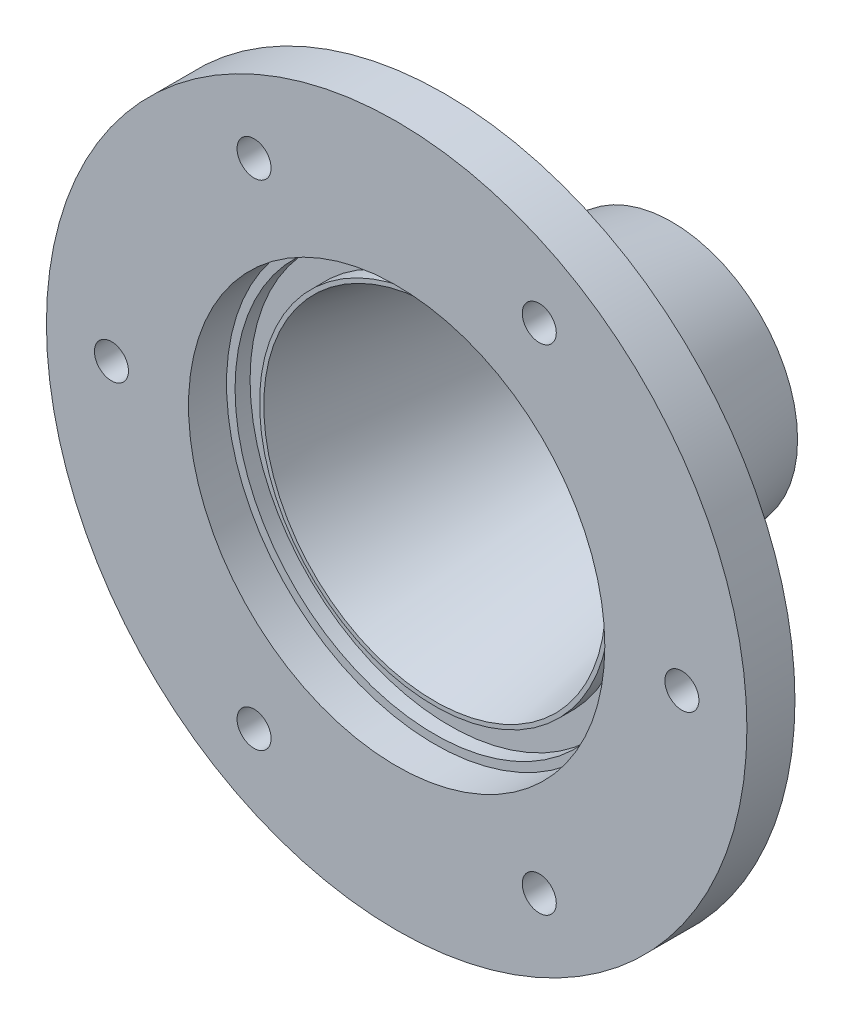
ISO-10303-21;
HEADER;
FILE_DESCRIPTION(('STEP AP214'),'2;1');
FILE_NAME('part.step','',(''),(''),'','','');
FILE_SCHEMA(('AUTOMOTIVE_DESIGN { 1 0 10303 214 1 1 1 1 }'));
ENDSEC;
DATA;
#1=APPLICATION_CONTEXT('core data for automotive mechanical design processes');
#2=APPLICATION_PROTOCOL_DEFINITION('international standard','automotive_design',2000,#1);
#3=PRODUCT_CONTEXT('',#1,'mechanical');
#4=PRODUCT('Part','Part','',(#3));
#5=PRODUCT_RELATED_PRODUCT_CATEGORY('part','',(#4));
#6=PRODUCT_DEFINITION_FORMATION('','',#4);
#7=PRODUCT_DEFINITION_CONTEXT('part definition',#1,'design');
#8=PRODUCT_DEFINITION('design','',#6,#7);
#9=PRODUCT_DEFINITION_SHAPE('','',#8);
#10=(LENGTH_UNIT() NAMED_UNIT(*) SI_UNIT(.MILLI.,.METRE.));
#11=(NAMED_UNIT(*) PLANE_ANGLE_UNIT() SI_UNIT($,.RADIAN.));
#12=(NAMED_UNIT(*) SI_UNIT($,.STERADIAN.) SOLID_ANGLE_UNIT());
#13=UNCERTAINTY_MEASURE_WITH_UNIT(LENGTH_MEASURE(1.E-05),#10,'distance_accuracy_value','');
#14=(GEOMETRIC_REPRESENTATION_CONTEXT(3) GLOBAL_UNCERTAINTY_ASSIGNED_CONTEXT((#13)) GLOBAL_UNIT_ASSIGNED_CONTEXT((#10,
#11,#12)) REPRESENTATION_CONTEXT('',''));
#15=CARTESIAN_POINT('',(0.,0.,0.));
#16=DIRECTION('',(0.,0.,1.));
#17=DIRECTION('',(1.,0.,0.));
#18=AXIS2_PLACEMENT_3D('',#15,#16,#17);
#19=CARTESIAN_POINT('',(0.,0.,-6.8));
#20=DIRECTION('',(0.,0.,1.));
#21=DIRECTION('',(1.,0.,0.));
#22=AXIS2_PLACEMENT_3D('',#19,#20,#21);
#23=CYLINDRICAL_SURFACE('',#22,35.);
#24=CARTESIAN_POINT('',(0.,0.,0.));
#25=DIRECTION('',(0.,0.,1.));
#26=DIRECTION('',(1.,0.,0.));
#27=AXIS2_PLACEMENT_3D('',#24,#25,#26);
#28=CIRCLE('',#27,35.);
#29=CARTESIAN_POINT('',(35.,0.,0.));
#30=VERTEX_POINT('',#29);
#31=EDGE_CURVE('E10',#30,#30,#28,.T.);
#32=ORIENTED_EDGE('',*,*,#31,.F.);
#33=EDGE_LOOP('',(#32));
#34=FACE_BOUND('',#33,.T.);
#35=CARTESIAN_POINT('',(0.,0.,-4.8));
#36=DIRECTION('',(0.,0.,-1.));
#37=DIRECTION('',(-1.,0.,0.));
#38=AXIS2_PLACEMENT_3D('',#35,#36,#37);
#39=CIRCLE('',#38,35.);
#40=CARTESIAN_POINT('',(-35.,0.,-4.8));
#41=VERTEX_POINT('',#40);
#42=EDGE_CURVE('E78',#41,#41,#39,.F.);
#43=ORIENTED_EDGE('',*,*,#42,.T.);
#44=EDGE_LOOP('',(#43));
#45=FACE_BOUND('',#44,.T.);
#46=ADVANCED_FACE('F32',(#34,#45),#23,.T.);
#47=CARTESIAN_POINT('',(-28.5,0.,0.));
#48=DIRECTION('',(0.,0.,1.));
#49=DIRECTION('',(1.,0.,0.));
#50=AXIS2_PLACEMENT_3D('',#47,#48,#49);
#51=CYLINDRICAL_SURFACE('',#50,1.7);
#52=CARTESIAN_POINT('',(-28.5,0.,0.));
#53=DIRECTION('',(0.,0.,1.));
#54=DIRECTION('',(1.,0.,0.));
#55=AXIS2_PLACEMENT_3D('',#52,#53,#54);
#56=CIRCLE('',#55,1.7);
#57=CARTESIAN_POINT('',(-26.8,0.,0.));
#58=VERTEX_POINT('',#57);
#59=EDGE_CURVE('E39',#58,#58,#56,.T.);
#60=ORIENTED_EDGE('',*,*,#59,.T.);
#61=EDGE_LOOP('',(#60));
#62=FACE_BOUND('',#61,.T.);
#63=CARTESIAN_POINT('',(-28.5,0.,-4.8));
#64=DIRECTION('',(0.,0.,-1.));
#65=DIRECTION('',(-1.,0.,0.));
#66=AXIS2_PLACEMENT_3D('',#63,#64,#65);
#67=CIRCLE('',#66,1.7);
#68=CARTESIAN_POINT('',(-30.2,0.,-4.8));
#69=VERTEX_POINT('',#68);
#70=EDGE_CURVE('E75',#69,#69,#67,.F.);
#71=ORIENTED_EDGE('',*,*,#70,.F.);
#72=EDGE_LOOP('',(#71));
#73=FACE_BOUND('',#72,.T.);
#74=ADVANCED_FACE('F124',(#62,#73),#51,.F.);
#75=CARTESIAN_POINT('',(-14.2499999999999,-24.6817240078565,0.));
#76=DIRECTION('',(0.,0.,1.));
#77=DIRECTION('',(1.,0.,0.));
#78=AXIS2_PLACEMENT_3D('',#75,#76,#77);
#79=CYLINDRICAL_SURFACE('',#78,1.7);
#80=CARTESIAN_POINT('',(-14.2499999999999,-24.6817240078565,0.));
#81=DIRECTION('',(0.,0.,1.));
#82=DIRECTION('',(1.,0.,0.));
#83=AXIS2_PLACEMENT_3D('',#80,#81,#82);
#84=CIRCLE('',#83,1.7);
#85=CARTESIAN_POINT('',(-12.5499999999999,-24.6817240078565,0.));
#86=VERTEX_POINT('',#85);
#87=EDGE_CURVE('E44',#86,#86,#84,.T.);
#88=ORIENTED_EDGE('',*,*,#87,.T.);
#89=EDGE_LOOP('',(#88));
#90=FACE_BOUND('',#89,.T.);
#91=CARTESIAN_POINT('',(-14.2499999999999,-24.6817240078565,-4.8));
#92=DIRECTION('',(0.,0.,-1.));
#93=DIRECTION('',(-1.,0.,0.));
#94=AXIS2_PLACEMENT_3D('',#91,#92,#93);
#95=CIRCLE('',#94,1.7);
#96=CARTESIAN_POINT('',(-15.9499999999999,-24.6817240078565,-4.8));
#97=VERTEX_POINT('',#96);
#98=EDGE_CURVE('E72',#97,#97,#95,.F.);
#99=ORIENTED_EDGE('',*,*,#98,.F.);
#100=EDGE_LOOP('',(#99));
#101=FACE_BOUND('',#100,.T.);
#102=ADVANCED_FACE('F113',(#90,#101),#79,.F.);
#103=CARTESIAN_POINT('',(14.2500000000001,-24.6817240078564,0.));
#104=DIRECTION('',(0.,0.,1.));
#105=DIRECTION('',(1.,0.,0.));
#106=AXIS2_PLACEMENT_3D('',#103,#104,#105);
#107=CYLINDRICAL_SURFACE('',#106,1.7);
#108=CARTESIAN_POINT('',(14.2500000000001,-24.6817240078564,0.));
#109=DIRECTION('',(0.,0.,1.));
#110=DIRECTION('',(1.,0.,0.));
#111=AXIS2_PLACEMENT_3D('',#108,#109,#110);
#112=CIRCLE('',#111,1.7);
#113=CARTESIAN_POINT('',(15.9500000000001,-24.6817240078564,0.));
#114=VERTEX_POINT('',#113);
#115=EDGE_CURVE('E108',#114,#114,#112,.T.);
#116=ORIENTED_EDGE('',*,*,#115,.T.);
#117=EDGE_LOOP('',(#116));
#118=FACE_BOUND('',#117,.T.);
#119=CARTESIAN_POINT('',(14.2500000000001,-24.6817240078564,-4.8));
#120=DIRECTION('',(0.,0.,-1.));
#121=DIRECTION('',(-1.,0.,0.));
#122=AXIS2_PLACEMENT_3D('',#119,#120,#121);
#123=CIRCLE('',#122,1.7);
#124=CARTESIAN_POINT('',(12.5500000000001,-24.6817240078564,-4.8));
#125=VERTEX_POINT('',#124);
#126=EDGE_CURVE('E69',#125,#125,#123,.F.);
#127=ORIENTED_EDGE('',*,*,#126,.F.);
#128=EDGE_LOOP('',(#127));
#129=FACE_BOUND('',#128,.T.);
#130=ADVANCED_FACE('F165',(#118,#129),#107,.F.);
#131=CARTESIAN_POINT('',(28.5,0.,0.));
#132=DIRECTION('',(0.,0.,1.));
#133=DIRECTION('',(1.,0.,0.));
#134=AXIS2_PLACEMENT_3D('',#131,#132,#133);
#135=CYLINDRICAL_SURFACE('',#134,1.7);
#136=CARTESIAN_POINT('',(28.5,0.,0.));
#137=DIRECTION('',(0.,0.,1.));
#138=DIRECTION('',(1.,0.,0.));
#139=AXIS2_PLACEMENT_3D('',#136,#137,#138);
#140=CIRCLE('',#139,1.7);
#141=CARTESIAN_POINT('',(30.2,0.,0.));
#142=VERTEX_POINT('',#141);
#143=EDGE_CURVE('E105',#142,#142,#140,.T.);
#144=ORIENTED_EDGE('',*,*,#143,.T.);
#145=EDGE_LOOP('',(#144));
#146=FACE_BOUND('',#145,.T.);
#147=CARTESIAN_POINT('',(28.5,0.,-4.8));
#148=DIRECTION('',(0.,0.,-1.));
#149=DIRECTION('',(-1.,0.,0.));
#150=AXIS2_PLACEMENT_3D('',#147,#148,#149);
#151=CIRCLE('',#150,1.7);
#152=CARTESIAN_POINT('',(26.8,0.,-4.8));
#153=VERTEX_POINT('',#152);
#154=EDGE_CURVE('E54',#153,#153,#151,.F.);
#155=ORIENTED_EDGE('',*,*,#154,.F.);
#156=EDGE_LOOP('',(#155));
#157=FACE_BOUND('',#156,.T.);
#158=ADVANCED_FACE('F172',(#146,#157),#135,.F.);
#159=CARTESIAN_POINT('',(14.2499999999998,24.6817240078566,0.));
#160=DIRECTION('',(0.,0.,1.));
#161=DIRECTION('',(1.,0.,0.));
#162=AXIS2_PLACEMENT_3D('',#159,#160,#161);
#163=CYLINDRICAL_SURFACE('',#162,1.7);
#164=CARTESIAN_POINT('',(14.2499999999998,24.6817240078566,0.));
#165=DIRECTION('',(0.,0.,1.));
#166=DIRECTION('',(1.,0.,0.));
#167=AXIS2_PLACEMENT_3D('',#164,#165,#166);
#168=CIRCLE('',#167,1.7);
#169=CARTESIAN_POINT('',(15.9499999999998,24.6817240078566,0.));
#170=VERTEX_POINT('',#169);
#171=EDGE_CURVE('E102',#170,#170,#168,.T.);
#172=ORIENTED_EDGE('',*,*,#171,.T.);
#173=EDGE_LOOP('',(#172));
#174=FACE_BOUND('',#173,.T.);
#175=CARTESIAN_POINT('',(14.2499999999998,24.6817240078566,-4.8));
#176=DIRECTION('',(0.,0.,-1.));
#177=DIRECTION('',(-1.,0.,0.));
#178=AXIS2_PLACEMENT_3D('',#175,#176,#177);
#179=CIRCLE('',#178,1.7);
#180=CARTESIAN_POINT('',(12.5499999999998,24.6817240078566,-4.8));
#181=VERTEX_POINT('',#180);
#182=EDGE_CURVE('E49',#181,#181,#179,.F.);
#183=ORIENTED_EDGE('',*,*,#182,.F.);
#184=EDGE_LOOP('',(#183));
#185=FACE_BOUND('',#184,.T.);
#186=ADVANCED_FACE('F180',(#174,#185),#163,.F.);
#187=CARTESIAN_POINT('',(-14.2500000000003,24.6817240078563,0.));
#188=DIRECTION('',(0.,0.,1.));
#189=DIRECTION('',(1.,0.,0.));
#190=AXIS2_PLACEMENT_3D('',#187,#188,#189);
#191=CYLINDRICAL_SURFACE('',#190,1.7);
#192=CARTESIAN_POINT('',(-14.2500000000003,24.6817240078563,0.));
#193=DIRECTION('',(0.,0.,1.));
#194=DIRECTION('',(1.,0.,0.));
#195=AXIS2_PLACEMENT_3D('',#192,#193,#194);
#196=CIRCLE('',#195,1.7);
#197=CARTESIAN_POINT('',(-12.5500000000003,24.6817240078563,0.));
#198=VERTEX_POINT('',#197);
#199=EDGE_CURVE('E97',#198,#198,#196,.T.);
#200=ORIENTED_EDGE('',*,*,#199,.T.);
#201=EDGE_LOOP('',(#200));
#202=FACE_BOUND('',#201,.T.);
#203=CARTESIAN_POINT('',(-14.2500000000003,24.6817240078563,-4.8));
#204=DIRECTION('',(0.,0.,-1.));
#205=DIRECTION('',(-1.,0.,0.));
#206=AXIS2_PLACEMENT_3D('',#203,#204,#205);
#207=CIRCLE('',#206,1.7);
#208=CARTESIAN_POINT('',(-15.9500000000003,24.6817240078563,-4.8));
#209=VERTEX_POINT('',#208);
#210=EDGE_CURVE('E47',#209,#209,#207,.F.);
#211=ORIENTED_EDGE('',*,*,#210,.F.);
#212=EDGE_LOOP('',(#211));
#213=FACE_BOUND('',#212,.T.);
#214=ADVANCED_FACE('F120',(#202,#213),#191,.F.);
#215=CARTESIAN_POINT('',(0.,0.,0.));
#216=DIRECTION('',(0.,0.,1.));
#217=DIRECTION('',(1.,0.,0.));
#218=AXIS2_PLACEMENT_3D('',#215,#216,#217);
#219=PLANE('',#218);
#220=CARTESIAN_POINT('',(0.,0.,0.));
#221=DIRECTION('',(0.,0.,1.));
#222=DIRECTION('',(1.,0.,0.));
#223=AXIS2_PLACEMENT_3D('',#220,#221,#222);
#224=CIRCLE('',#223,20.8);
#225=CARTESIAN_POINT('',(20.8,0.,0.));
#226=VERTEX_POINT('',#225);
#227=EDGE_CURVE('E91',#226,#226,#224,.T.);
#228=ORIENTED_EDGE('',*,*,#227,.F.);
#229=EDGE_LOOP('',(#228));
#230=FACE_BOUND('',#229,.T.);
#231=ORIENTED_EDGE('',*,*,#199,.F.);
#232=EDGE_LOOP('',(#231));
#233=FACE_BOUND('',#232,.T.);
#234=ORIENTED_EDGE('',*,*,#171,.F.);
#235=EDGE_LOOP('',(#234));
#236=FACE_BOUND('',#235,.T.);
#237=ORIENTED_EDGE('',*,*,#143,.F.);
#238=EDGE_LOOP('',(#237));
#239=FACE_BOUND('',#238,.T.);
#240=ORIENTED_EDGE('',*,*,#115,.F.);
#241=EDGE_LOOP('',(#240));
#242=FACE_BOUND('',#241,.T.);
#243=ORIENTED_EDGE('',*,*,#87,.F.);
#244=EDGE_LOOP('',(#243));
#245=FACE_BOUND('',#244,.T.);
#246=ORIENTED_EDGE('',*,*,#59,.F.);
#247=EDGE_LOOP('',(#246));
#248=FACE_BOUND('',#247,.T.);
#249=ORIENTED_EDGE('',*,*,#31,.T.);
#250=EDGE_LOOP('',(#249));
#251=FACE_BOUND('',#250,.T.);
#252=ADVANCED_FACE('F116',(#230,#233,#236,#239,#242,#245,#248,#251),#219,.T.);
#253=CARTESIAN_POINT('',(0.,0.,-3.8));
#254=DIRECTION('',(0.,0.,1.));
#255=DIRECTION('',(1.,0.,0.));
#256=AXIS2_PLACEMENT_3D('',#253,#254,#255);
#257=CYLINDRICAL_SURFACE('',#256,20.8);
#258=CARTESIAN_POINT('',(0.,0.,-3.8));
#259=DIRECTION('',(0.,0.,1.));
#260=DIRECTION('',(1.,0.,0.));
#261=AXIS2_PLACEMENT_3D('',#258,#259,#260);
#262=CIRCLE('',#261,20.8);
#263=CARTESIAN_POINT('',(20.8,0.,-3.8));
#264=VERTEX_POINT('',#263);
#265=EDGE_CURVE('E94',#264,#264,#262,.T.);
#266=CARTESIAN_POINT('',(20.8,0.,-3.8));
#267=CARTESIAN_POINT('',(20.8,0.,-3.76041666666667));
#268=CARTESIAN_POINT('',(20.8,0.,-3.72083333333333));
#269=CARTESIAN_POINT('',(20.8,0.,-3.64166666666667));
#270=CARTESIAN_POINT('',(20.8,0.,-3.60208333333333));
#271=CARTESIAN_POINT('',(20.8,0.,-3.52291666666667));
#272=CARTESIAN_POINT('',(20.8,0.,-3.48333333333333));
#273=CARTESIAN_POINT('',(20.8,0.,-3.40416666666667));
#274=CARTESIAN_POINT('',(20.8,0.,-3.36458333333333));
#275=CARTESIAN_POINT('',(20.8,0.,-3.28541666666667));
#276=CARTESIAN_POINT('',(20.8,0.,-3.24583333333333));
#277=CARTESIAN_POINT('',(20.8,0.,-3.16666666666667));
#278=CARTESIAN_POINT('',(20.8,0.,-3.12708333333333));
#279=CARTESIAN_POINT('',(20.8,0.,-3.04791666666667));
#280=CARTESIAN_POINT('',(20.8,0.,-3.00833333333333));
#281=CARTESIAN_POINT('',(20.8,0.,-2.92916666666667));
#282=CARTESIAN_POINT('',(20.8,0.,-2.88958333333333));
#283=CARTESIAN_POINT('',(20.8,0.,-2.81041666666667));
#284=CARTESIAN_POINT('',(20.8,0.,-2.77083333333333));
#285=CARTESIAN_POINT('',(20.8,0.,-2.69166666666667));
#286=CARTESIAN_POINT('',(20.8,0.,-2.65208333333333));
#287=CARTESIAN_POINT('',(20.8,0.,-2.57291666666667));
#288=CARTESIAN_POINT('',(20.8,0.,-2.53333333333333));
#289=CARTESIAN_POINT('',(20.8,0.,-2.45416666666667));
#290=CARTESIAN_POINT('',(20.8,0.,-2.41458333333333));
#291=CARTESIAN_POINT('',(20.8,0.,-2.33541666666667));
#292=CARTESIAN_POINT('',(20.8,0.,-2.29583333333333));
#293=CARTESIAN_POINT('',(20.8,0.,-2.21666666666667));
#294=CARTESIAN_POINT('',(20.8,0.,-2.17708333333333));
#295=CARTESIAN_POINT('',(20.8,0.,-2.09791666666667));
#296=CARTESIAN_POINT('',(20.8,0.,-2.05833333333333));
#297=CARTESIAN_POINT('',(20.8,0.,-1.97916666666667));
#298=CARTESIAN_POINT('',(20.8,0.,-1.93958333333333));
#299=CARTESIAN_POINT('',(20.8,0.,-1.86041666666667));
#300=CARTESIAN_POINT('',(20.8,0.,-1.82083333333333));
#301=CARTESIAN_POINT('',(20.8,0.,-1.74166666666667));
#302=CARTESIAN_POINT('',(20.8,0.,-1.70208333333333));
#303=CARTESIAN_POINT('',(20.8,0.,-1.62291666666667));
#304=CARTESIAN_POINT('',(20.8,0.,-1.58333333333333));
#305=CARTESIAN_POINT('',(20.8,0.,-1.50416666666667));
#306=CARTESIAN_POINT('',(20.8,0.,-1.46458333333333));
#307=CARTESIAN_POINT('',(20.8,0.,-1.38541666666667));
#308=CARTESIAN_POINT('',(20.8,0.,-1.34583333333333));
#309=CARTESIAN_POINT('',(20.8,0.,-1.26666666666667));
#310=CARTESIAN_POINT('',(20.8,0.,-1.22708333333333));
#311=CARTESIAN_POINT('',(20.8,0.,-1.14791666666667));
#312=CARTESIAN_POINT('',(20.8,0.,-1.10833333333333));
#313=CARTESIAN_POINT('',(20.8,0.,-1.02916666666667));
#314=CARTESIAN_POINT('',(20.8,0.,-0.989583333333334));
#315=CARTESIAN_POINT('',(20.8,0.,-0.910416666666667));
#316=CARTESIAN_POINT('',(20.8,0.,-0.870833333333333));
#317=CARTESIAN_POINT('',(20.8,0.,-0.791666666666667));
#318=CARTESIAN_POINT('',(20.8,0.,-0.752083333333333));
#319=CARTESIAN_POINT('',(20.8,0.,-0.672916666666667));
#320=CARTESIAN_POINT('',(20.8,0.,-0.633333333333333));
#321=CARTESIAN_POINT('',(20.8,0.,-0.554166666666667));
#322=CARTESIAN_POINT('',(20.8,0.,-0.514583333333334));
#323=CARTESIAN_POINT('',(20.8,0.,-0.435416666666667));
#324=CARTESIAN_POINT('',(20.8,0.,-0.395833333333334));
#325=CARTESIAN_POINT('',(20.8,0.,-0.316666666666667));
#326=CARTESIAN_POINT('',(20.8,0.,-0.277083333333333));
#327=CARTESIAN_POINT('',(20.8,0.,-0.197916666666667));
#328=CARTESIAN_POINT('',(20.8,0.,-0.158333333333333));
#329=CARTESIAN_POINT('',(20.8,0.,-0.0791666666666666));
#330=CARTESIAN_POINT('',(20.8,0.,-0.0395833333333333));
#331=CARTESIAN_POINT('',(20.8,0.,0.));
#332=B_SPLINE_CURVE_WITH_KNOTS('',3,(#266,#267,#268,#269,#270,#271,#272,#273,#274,#275,#276,
#277,#278,#279,#280,#281,#282,#283,#284,#285,#286,#287,#288,#289,#290,#291,#292,#293,#294,#295,
#296,#297,#298,#299,#300,#301,#302,#303,#304,#305,#306,#307,#308,#309,#310,#311,#312,#313,#314,
#315,#316,#317,#318,#319,#320,#321,#322,#323,#324,#325,#326,#327,#328,#329,#330,#331),
.UNSPECIFIED.,.F.,.F.,(4,2,2,2,2,2,2,2,2,2,2,2,2,2,2,2,2,2,2,2,2,2,2,2,2,2,2,2,2,2,2,2,4),(0.,
0.11875,0.2375,0.35625,0.475,0.59375,0.7125,0.83125,0.95,1.06875,1.1875,1.30625,1.425,1.54375,
1.6625,1.78125,1.9,2.01875,2.1375,2.25625,2.375,2.49375,2.6125,2.73125,2.85,2.96875,3.0875,
3.20625,3.325,3.44375,3.5625,3.68125,3.8),.UNSPECIFIED.);
#333=EDGE_CURVE('BSEAM119',#264,#226,#332,.T.);
#334=ORIENTED_EDGE('',*,*,#265,.F.);
#335=ORIENTED_EDGE('',*,*,#227,.T.);
#336=ORIENTED_EDGE('',*,*,#333,.T.);
#337=ORIENTED_EDGE('',*,*,#333,.F.);
#338=EDGE_LOOP('',(#334,#336,#335,#337));
#339=FACE_BOUND('',#338,.T.);
#340=ADVANCED_FACE('F119',(#339),#257,.F.);
#341=CARTESIAN_POINT('',(0.,0.,-3.8));
#342=DIRECTION('',(0.,0.,1.));
#343=DIRECTION('',(1.,0.,0.));
#344=AXIS2_PLACEMENT_3D('',#341,#342,#343);
#345=PLANE('',#344);
#346=CARTESIAN_POINT('',(0.,0.,-3.8));
#347=DIRECTION('',(0.,0.,1.));
#348=DIRECTION('',(1.,0.,0.));
#349=AXIS2_PLACEMENT_3D('',#346,#347,#348);
#350=CIRCLE('',#349,19.95);
#351=CARTESIAN_POINT('',(19.95,0.,-3.8));
#352=VERTEX_POINT('',#351);
#353=EDGE_CURVE('E85',#352,#352,#350,.T.);
#354=ORIENTED_EDGE('',*,*,#353,.F.);
#355=EDGE_LOOP('',(#354));
#356=FACE_BOUND('',#355,.T.);
#357=ORIENTED_EDGE('',*,*,#265,.T.);
#358=EDGE_LOOP('',(#357));
#359=FACE_BOUND('',#358,.T.);
#360=ADVANCED_FACE('F145',(#356,#359),#345,.T.);
#361=CARTESIAN_POINT('',(0.,0.,-5.3));
#362=DIRECTION('',(0.,0.,1.));
#363=DIRECTION('',(1.,0.,0.));
#364=AXIS2_PLACEMENT_3D('',#361,#362,#363);
#365=CYLINDRICAL_SURFACE('',#364,19.95);
#366=CARTESIAN_POINT('',(0.,0.,-5.3));
#367=DIRECTION('',(0.,0.,1.));
#368=DIRECTION('',(1.,0.,0.));
#369=AXIS2_PLACEMENT_3D('',#366,#367,#368);
#370=CIRCLE('',#369,19.95);
#371=CARTESIAN_POINT('',(19.95,0.,-5.3));
#372=VERTEX_POINT('',#371);
#373=EDGE_CURVE('E88',#372,#372,#370,.T.);
#374=ORIENTED_EDGE('',*,*,#373,.F.);
#375=EDGE_LOOP('',(#374));
#376=FACE_BOUND('',#375,.T.);
#377=ORIENTED_EDGE('',*,*,#353,.T.);
#378=EDGE_LOOP('',(#377));
#379=FACE_BOUND('',#378,.T.);
#380=ADVANCED_FACE('F213',(#376,#379),#365,.F.);
#381=CARTESIAN_POINT('',(0.,0.,-5.3));
#382=DIRECTION('',(0.,0.,1.));
#383=DIRECTION('',(1.,0.,0.));
#384=AXIS2_PLACEMENT_3D('',#381,#382,#383);
#385=PLANE('',#384);
#386=CARTESIAN_POINT('',(0.,0.,-5.3));
#387=DIRECTION('',(0.,0.,1.));
#388=DIRECTION('',(1.,0.,0.));
#389=AXIS2_PLACEMENT_3D('',#386,#387,#388);
#390=CIRCLE('',#389,17.5);
#391=CARTESIAN_POINT('',(17.5,0.,-5.3));
#392=VERTEX_POINT('',#391);
#393=EDGE_CURVE('E82',#392,#392,#390,.T.);
#394=ORIENTED_EDGE('',*,*,#393,.F.);
#395=EDGE_LOOP('',(#394));
#396=FACE_BOUND('',#395,.T.);
#397=ORIENTED_EDGE('',*,*,#373,.T.);
#398=EDGE_LOOP('',(#397));
#399=FACE_BOUND('',#398,.T.);
#400=ADVANCED_FACE('F220',(#396,#399),#385,.T.);
#401=CARTESIAN_POINT('',(0.,0.,-5.3));
#402=DIRECTION('',(0.,0.,1.));
#403=DIRECTION('',(1.,0.,0.));
#404=AXIS2_PLACEMENT_3D('',#401,#402,#403);
#405=CYLINDRICAL_SURFACE('',#404,17.5);
#406=ORIENTED_EDGE('',*,*,#393,.T.);
#407=EDGE_LOOP('',(#406));
#408=FACE_BOUND('',#407,.T.);
#409=CARTESIAN_POINT('',(0.,0.,-3.8));
#410=DIRECTION('',(0.,0.,1.));
#411=DIRECTION('',(1.,0.,0.));
#412=AXIS2_PLACEMENT_3D('',#409,#410,#411);
#413=CIRCLE('',#412,17.5);
#414=CARTESIAN_POINT('',(17.5,0.,-3.8));
#415=VERTEX_POINT('',#414);
#416=EDGE_CURVE('E81',#415,#415,#413,.T.);
#417=ORIENTED_EDGE('',*,*,#416,.F.);
#418=EDGE_LOOP('',(#417));
#419=FACE_BOUND('',#418,.T.);
#420=ADVANCED_FACE('F142',(#408,#419),#405,.T.);
#421=CARTESIAN_POINT('',(0.,0.,-3.8));
#422=DIRECTION('',(0.,0.,1.));
#423=DIRECTION('',(1.,0.,0.));
#424=AXIS2_PLACEMENT_3D('',#421,#422,#423);
#425=CIRCLE('',#424,17.08);
#426=CARTESIAN_POINT('',(17.08,0.,-3.8));
#427=VERTEX_POINT('',#426);
#428=EDGE_CURVE('E283',#427,#427,#425,.T.);
#429=ORIENTED_EDGE('',*,*,#428,.F.);
#430=EDGE_LOOP('',(#429));
#431=FACE_BOUND('',#430,.T.);
#432=ORIENTED_EDGE('',*,*,#416,.T.);
#433=EDGE_LOOP('',(#432));
#434=FACE_BOUND('',#433,.T.);
#435=ADVANCED_FACE('F133',(#431,#434),#345,.T.);
#436=CARTESIAN_POINT('',(0.,0.,-4.8));
#437=DIRECTION('',(0.,0.,-1.));
#438=DIRECTION('',(-1.,0.,0.));
#439=AXIS2_PLACEMENT_3D('',#436,#437,#438);
#440=PLANE('',#439);
#441=ORIENTED_EDGE('',*,*,#42,.F.);
#442=EDGE_LOOP('',(#441));
#443=FACE_BOUND('',#442,.T.);
#444=CARTESIAN_POINT('',(0.,0.,-4.8));
#445=DIRECTION('',(0.,0.,-1.));
#446=DIRECTION('',(-1.,0.,0.));
#447=AXIS2_PLACEMENT_3D('',#444,#445,#446);
#448=CIRCLE('',#447,24.95);
#449=CARTESIAN_POINT('',(-24.95,0.,-4.8));
#450=VERTEX_POINT('',#449);
#451=EDGE_CURVE('E50',#450,#450,#448,.T.);
#452=ORIENTED_EDGE('',*,*,#451,.F.);
#453=EDGE_LOOP('',(#452));
#454=FACE_BOUND('',#453,.T.);
#455=ORIENTED_EDGE('',*,*,#210,.T.);
#456=EDGE_LOOP('',(#455));
#457=FACE_BOUND('',#456,.T.);
#458=ORIENTED_EDGE('',*,*,#182,.T.);
#459=EDGE_LOOP('',(#458));
#460=FACE_BOUND('',#459,.T.);
#461=ORIENTED_EDGE('',*,*,#154,.T.);
#462=EDGE_LOOP('',(#461));
#463=FACE_BOUND('',#462,.T.);
#464=ORIENTED_EDGE('',*,*,#126,.T.);
#465=EDGE_LOOP('',(#464));
#466=FACE_BOUND('',#465,.T.);
#467=ORIENTED_EDGE('',*,*,#98,.T.);
#468=EDGE_LOOP('',(#467));
#469=FACE_BOUND('',#468,.T.);
#470=ORIENTED_EDGE('',*,*,#70,.T.);
#471=EDGE_LOOP('',(#470));
#472=FACE_BOUND('',#471,.T.);
#473=ADVANCED_FACE('F130',(#443,#454,#457,#460,#463,#466,#469,#472),#440,.T.);
#474=CARTESIAN_POINT('',(0.,0.,-4.8));
#475=DIRECTION('',(0.,0.,-1.));
#476=DIRECTION('',(-1.,0.,0.));
#477=AXIS2_PLACEMENT_3D('',#474,#475,#476);
#478=CYLINDRICAL_SURFACE('',#477,24.95);
#479=ORIENTED_EDGE('',*,*,#451,.T.);
#480=EDGE_LOOP('',(#479));
#481=FACE_BOUND('',#480,.T.);
#482=CARTESIAN_POINT('',(0.,0.,-6.8));
#483=DIRECTION('',(0.,0.,-1.));
#484=DIRECTION('',(-1.,0.,0.));
#485=AXIS2_PLACEMENT_3D('',#482,#483,#484);
#486=CIRCLE('',#485,24.95);
#487=CARTESIAN_POINT('',(-24.95,0.,-6.8));
#488=VERTEX_POINT('',#487);
#489=EDGE_CURVE('E57',#488,#488,#486,.T.);
#490=ORIENTED_EDGE('',*,*,#489,.F.);
#491=EDGE_LOOP('',(#490));
#492=FACE_BOUND('',#491,.T.);
#493=ADVANCED_FACE('F132',(#481,#492),#478,.T.);
#494=CARTESIAN_POINT('',(0.,0.,-6.8));
#495=DIRECTION('',(0.,0.,1.));
#496=DIRECTION('',(1.,0.,0.));
#497=AXIS2_PLACEMENT_3D('',#494,#495,#496);
#498=PLANE('',#497);
#499=CARTESIAN_POINT('',(0.,0.,-6.8));
#500=DIRECTION('',(0.,0.,1.));
#501=DIRECTION('',(1.,0.,0.));
#502=AXIS2_PLACEMENT_3D('',#499,#500,#501);
#503=CIRCLE('',#502,16.635);
#504=CARTESIAN_POINT('',(16.635,0.,-6.8));
#505=VERTEX_POINT('',#504);
#506=EDGE_CURVE('E281',#505,#505,#503,.T.);
#507=ORIENTED_EDGE('',*,*,#506,.T.);
#508=EDGE_LOOP('',(#507));
#509=FACE_BOUND('',#508,.T.);
#510=ORIENTED_EDGE('',*,*,#489,.T.);
#511=EDGE_LOOP('',(#510));
#512=FACE_BOUND('',#511,.T.);
#513=ADVANCED_FACE('F140',(#509,#512),#498,.F.);
#514=CARTESIAN_POINT('',(0.,0.,-6.8));
#515=DIRECTION('',(0.,0.,1.));
#516=DIRECTION('',(1.,0.,0.));
#517=AXIS2_PLACEMENT_3D('',#514,#515,#516);
#518=CONICAL_SURFACE('',#517,16.635,0.194255145746969);
#519=CARTESIAN_POINT('',(0.,0.,-27.5));
#520=DIRECTION('',(0.,0.,1.));
#521=DIRECTION('',(1.,0.,0.));
#522=AXIS2_PLACEMENT_3D('',#519,#520,#521);
#523=CIRCLE('',#522,12.562564620742);
#524=CARTESIAN_POINT('',(12.562564620742,0.,-27.5));
#525=VERTEX_POINT('',#524);
#526=EDGE_CURVE('E62',#525,#525,#523,.T.);
#527=ORIENTED_EDGE('',*,*,#526,.T.);
#528=EDGE_LOOP('',(#527));
#529=FACE_BOUND('',#528,.T.);
#530=ORIENTED_EDGE('',*,*,#506,.F.);
#531=EDGE_LOOP('',(#530));
#532=FACE_BOUND('',#531,.T.);
#533=ADVANCED_FACE('F244',(#529,#532),#518,.T.);
#534=CARTESIAN_POINT('',(0.,0.,-27.5));
#535=DIRECTION('',(0.,0.,1.));
#536=DIRECTION('',(1.,0.,0.));
#537=AXIS2_PLACEMENT_3D('',#534,#535,#536);
#538=PLANE('',#537);
#539=CARTESIAN_POINT('',(0.,0.,-27.5));
#540=DIRECTION('',(0.,0.,1.));
#541=DIRECTION('',(1.,0.,0.));
#542=AXIS2_PLACEMENT_3D('',#539,#540,#541);
#543=CIRCLE('',#542,12.4173565947626);
#544=CARTESIAN_POINT('',(12.4173565947626,0.,-27.5));
#545=VERTEX_POINT('',#544);
#546=EDGE_CURVE('E35',#545,#545,#543,.T.);
#547=ORIENTED_EDGE('',*,*,#546,.T.);
#548=EDGE_LOOP('',(#547));
#549=FACE_BOUND('',#548,.T.);
#550=ORIENTED_EDGE('',*,*,#526,.F.);
#551=EDGE_LOOP('',(#550));
#552=FACE_BOUND('',#551,.T.);
#553=ADVANCED_FACE('F249',(#549,#552),#538,.F.);
#554=CARTESIAN_POINT('',(0.,0.,-3.8));
#555=DIRECTION('',(0.,0.,1.));
#556=DIRECTION('',(1.,0.,0.));
#557=AXIS2_PLACEMENT_3D('',#554,#555,#556);
#558=CONICAL_SURFACE('',#557,17.08,0.194255145746969);
#559=ORIENTED_EDGE('',*,*,#428,.T.);
#560=EDGE_LOOP('',(#559));
#561=FACE_BOUND('',#560,.T.);
#562=ORIENTED_EDGE('',*,*,#546,.F.);
#563=EDGE_LOOP('',(#562));
#564=FACE_BOUND('',#563,.T.);
#565=ADVANCED_FACE('F254',(#561,#564),#558,.F.);
#566=CLOSED_SHELL('',(#46,#74,#102,#130,#158,#186,#214,#252,#340,#360,#380,#400,#420,#435,#473,
#493,#513,#533,#553,#565));
#567=MANIFOLD_SOLID_BREP('B2',#566);
#568=ADVANCED_BREP_SHAPE_REPRESENTATION('',(#18,#567),#14);
#569=SHAPE_DEFINITION_REPRESENTATION(#9,#568);
ENDSEC;
END-ISO-10303-21;
